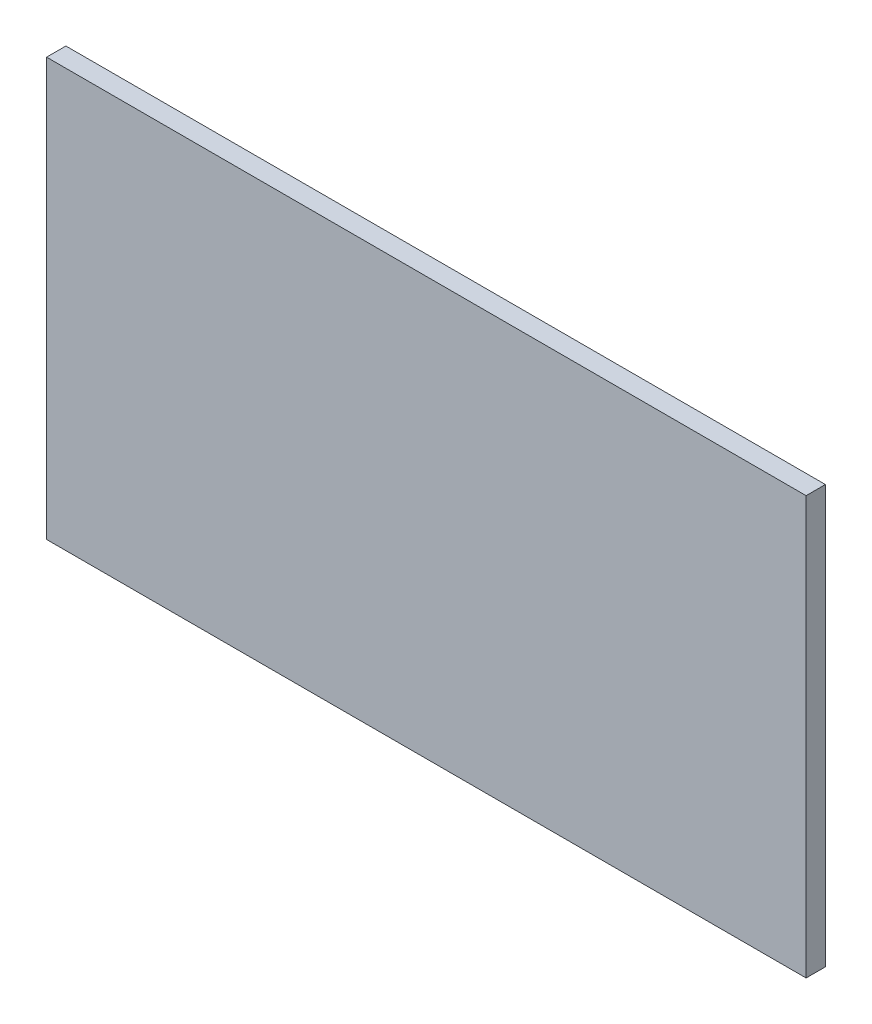
ISO-10303-21;
HEADER;
FILE_DESCRIPTION(('STEP AP214'),'2;1');
FILE_NAME('part.step','',(''),(''),'','','');
FILE_SCHEMA(('AUTOMOTIVE_DESIGN { 1 0 10303 214 1 1 1 1 }'));
ENDSEC;
DATA;
#1=APPLICATION_CONTEXT('core data for automotive mechanical design processes');
#2=APPLICATION_PROTOCOL_DEFINITION('international standard','automotive_design',2000,#1);
#3=PRODUCT_CONTEXT('',#1,'mechanical');
#4=PRODUCT('Part','Part','',(#3));
#5=PRODUCT_RELATED_PRODUCT_CATEGORY('part','',(#4));
#6=PRODUCT_DEFINITION_FORMATION('','',#4);
#7=PRODUCT_DEFINITION_CONTEXT('part definition',#1,'design');
#8=PRODUCT_DEFINITION('design','',#6,#7);
#9=PRODUCT_DEFINITION_SHAPE('','',#8);
#10=(LENGTH_UNIT() NAMED_UNIT(*) SI_UNIT(.MILLI.,.METRE.));
#11=(NAMED_UNIT(*) PLANE_ANGLE_UNIT() SI_UNIT($,.RADIAN.));
#12=(NAMED_UNIT(*) SI_UNIT($,.STERADIAN.) SOLID_ANGLE_UNIT());
#13=UNCERTAINTY_MEASURE_WITH_UNIT(LENGTH_MEASURE(1.E-05),#10,'distance_accuracy_value','');
#14=(GEOMETRIC_REPRESENTATION_CONTEXT(3) GLOBAL_UNCERTAINTY_ASSIGNED_CONTEXT((#13)) GLOBAL_UNIT_ASSIGNED_CONTEXT((#10,
#11,#12)) REPRESENTATION_CONTEXT('',''));
#15=CARTESIAN_POINT('',(0.,0.,0.));
#16=DIRECTION('',(0.,0.,1.));
#17=DIRECTION('',(1.,0.,0.));
#18=AXIS2_PLACEMENT_3D('',#15,#16,#17);
#19=CARTESIAN_POINT('',(50.,27.5,2.54));
#20=DIRECTION('',(-1.,0.,0.));
#21=DIRECTION('',(0.,-1.,0.));
#22=AXIS2_PLACEMENT_3D('',#19,#20,#21);
#23=PLANE('',#22);
#24=DIRECTION('',(0.,1.,0.));
#25=VECTOR('',#24,1.);
#26=CARTESIAN_POINT('',(50.,27.5,0.));
#27=LINE('',#26,#25);
#28=CARTESIAN_POINT('',(50.,-27.5,0.));
#29=VERTEX_POINT('',#28);
#30=CARTESIAN_POINT('',(50.,27.5,0.));
#31=VERTEX_POINT('',#30);
#32=EDGE_CURVE('E98',#29,#31,#27,.T.);
#33=ORIENTED_EDGE('',*,*,#32,.T.);
#34=DIRECTION('',(0.,0.,-1.));
#35=VECTOR('',#34,1.);
#36=CARTESIAN_POINT('',(50.,27.5,2.54));
#37=LINE('',#36,#35);
#38=CARTESIAN_POINT('',(50.,27.5,2.54));
#39=VERTEX_POINT('',#38);
#40=EDGE_CURVE('E11',#39,#31,#37,.T.);
#41=ORIENTED_EDGE('',*,*,#40,.F.);
#42=DIRECTION('',(0.,1.,0.));
#43=VECTOR('',#42,1.);
#44=CARTESIAN_POINT('',(50.,27.5,2.54));
#45=LINE('',#44,#43);
#46=CARTESIAN_POINT('',(50.,-27.5,2.54));
#47=VERTEX_POINT('',#46);
#48=EDGE_CURVE('E86',#47,#39,#45,.T.);
#49=ORIENTED_EDGE('',*,*,#48,.F.);
#50=DIRECTION('',(0.,0.,-1.));
#51=VECTOR('',#50,1.);
#52=CARTESIAN_POINT('',(50.,-27.5,2.54));
#53=LINE('',#52,#51);
#54=EDGE_CURVE('E94',#47,#29,#53,.T.);
#55=ORIENTED_EDGE('',*,*,#54,.T.);
#56=EDGE_LOOP('',(#33,#41,#49,#55));
#57=FACE_BOUND('',#56,.T.);
#58=ADVANCED_FACE('F35',(#57),#23,.F.);
#59=CARTESIAN_POINT('',(-50.,27.5,2.54));
#60=DIRECTION('',(0.,-1.,0.));
#61=DIRECTION('',(0.,0.,-1.));
#62=AXIS2_PLACEMENT_3D('',#59,#60,#61);
#63=PLANE('',#62);
#64=DIRECTION('',(-1.,0.,0.));
#65=VECTOR('',#64,1.);
#66=CARTESIAN_POINT('',(-50.,27.5,0.));
#67=LINE('',#66,#65);
#68=CARTESIAN_POINT('',(-50.,27.5,0.));
#69=VERTEX_POINT('',#68);
#70=EDGE_CURVE('E90',#31,#69,#67,.T.);
#71=ORIENTED_EDGE('',*,*,#70,.T.);
#72=DIRECTION('',(0.,0.,-1.));
#73=VECTOR('',#72,1.);
#74=CARTESIAN_POINT('',(-50.,27.5,2.54));
#75=LINE('',#74,#73);
#76=CARTESIAN_POINT('',(-50.,27.5,2.54));
#77=VERTEX_POINT('',#76);
#78=EDGE_CURVE('E43',#77,#69,#75,.T.);
#79=ORIENTED_EDGE('',*,*,#78,.F.);
#80=DIRECTION('',(-1.,0.,0.));
#81=VECTOR('',#80,1.);
#82=CARTESIAN_POINT('',(-50.,27.5,2.54));
#83=LINE('',#82,#81);
#84=EDGE_CURVE('E81',#39,#77,#83,.T.);
#85=ORIENTED_EDGE('',*,*,#84,.F.);
#86=ORIENTED_EDGE('',*,*,#40,.T.);
#87=EDGE_LOOP('',(#71,#79,#85,#86));
#88=FACE_BOUND('',#87,.T.);
#89=ADVANCED_FACE('F89',(#88),#63,.F.);
#90=CARTESIAN_POINT('',(-50.,27.5,2.54));
#91=DIRECTION('',(1.,0.,0.));
#92=DIRECTION('',(0.,1.,0.));
#93=AXIS2_PLACEMENT_3D('',#90,#91,#92);
#94=PLANE('',#93);
#95=DIRECTION('',(0.,-1.,0.));
#96=VECTOR('',#95,1.);
#97=CARTESIAN_POINT('',(-50.,27.5,0.));
#98=LINE('',#97,#96);
#99=CARTESIAN_POINT('',(-50.,-27.5,0.));
#100=VERTEX_POINT('',#99);
#101=EDGE_CURVE('E68',#69,#100,#98,.T.);
#102=ORIENTED_EDGE('',*,*,#101,.T.);
#103=DIRECTION('',(0.,0.,-1.));
#104=VECTOR('',#103,1.);
#105=CARTESIAN_POINT('',(-50.,-27.5,2.54));
#106=LINE('',#105,#104);
#107=CARTESIAN_POINT('',(-50.,-27.5,2.54));
#108=VERTEX_POINT('',#107);
#109=EDGE_CURVE('E91',#108,#100,#106,.T.);
#110=ORIENTED_EDGE('',*,*,#109,.F.);
#111=DIRECTION('',(0.,-1.,0.));
#112=VECTOR('',#111,1.);
#113=CARTESIAN_POINT('',(-50.,27.5,2.54));
#114=LINE('',#113,#112);
#115=EDGE_CURVE('E84',#77,#108,#114,.T.);
#116=ORIENTED_EDGE('',*,*,#115,.F.);
#117=ORIENTED_EDGE('',*,*,#78,.T.);
#118=EDGE_LOOP('',(#102,#110,#116,#117));
#119=FACE_BOUND('',#118,.T.);
#120=ADVANCED_FACE('F92',(#119),#94,.F.);
#121=CARTESIAN_POINT('',(-50.,-27.5,2.54));
#122=DIRECTION('',(0.,1.,0.));
#123=DIRECTION('',(0.,0.,1.));
#124=AXIS2_PLACEMENT_3D('',#121,#122,#123);
#125=PLANE('',#124);
#126=DIRECTION('',(1.,0.,0.));
#127=VECTOR('',#126,1.);
#128=CARTESIAN_POINT('',(-50.,-27.5,0.));
#129=LINE('',#128,#127);
#130=EDGE_CURVE('E74',#100,#29,#129,.T.);
#131=ORIENTED_EDGE('',*,*,#130,.T.);
#132=ORIENTED_EDGE('',*,*,#54,.F.);
#133=DIRECTION('',(1.,0.,0.));
#134=VECTOR('',#133,1.);
#135=CARTESIAN_POINT('',(-50.,-27.5,2.54));
#136=LINE('',#135,#134);
#137=EDGE_CURVE('E51',#108,#47,#136,.T.);
#138=ORIENTED_EDGE('',*,*,#137,.F.);
#139=ORIENTED_EDGE('',*,*,#109,.T.);
#140=EDGE_LOOP('',(#131,#132,#138,#139));
#141=FACE_BOUND('',#140,.T.);
#142=ADVANCED_FACE('F105',(#141),#125,.F.);
#143=CARTESIAN_POINT('',(0.,0.,2.54));
#144=DIRECTION('',(0.,0.,1.));
#145=DIRECTION('',(1.,0.,0.));
#146=AXIS2_PLACEMENT_3D('',#143,#144,#145);
#147=PLANE('',#146);
#148=ORIENTED_EDGE('',*,*,#48,.T.);
#149=ORIENTED_EDGE('',*,*,#84,.T.);
#150=ORIENTED_EDGE('',*,*,#115,.T.);
#151=ORIENTED_EDGE('',*,*,#137,.T.);
#152=EDGE_LOOP('',(#148,#149,#150,#151));
#153=FACE_BOUND('',#152,.T.);
#154=ADVANCED_FACE('F82',(#153),#147,.T.);
#155=CARTESIAN_POINT('',(0.,0.,0.));
#156=DIRECTION('',(0.,0.,1.));
#157=DIRECTION('',(1.,0.,0.));
#158=AXIS2_PLACEMENT_3D('',#155,#156,#157);
#159=PLANE('',#158);
#160=ORIENTED_EDGE('',*,*,#32,.F.);
#161=ORIENTED_EDGE('',*,*,#130,.F.);
#162=ORIENTED_EDGE('',*,*,#101,.F.);
#163=ORIENTED_EDGE('',*,*,#70,.F.);
#164=EDGE_LOOP('',(#160,#161,#162,#163));
#165=FACE_BOUND('',#164,.T.);
#166=ADVANCED_FACE('F108',(#165),#159,.F.);
#167=CLOSED_SHELL('',(#58,#89,#120,#142,#154,#166));
#168=MANIFOLD_SOLID_BREP('B2',#167);
#169=ADVANCED_BREP_SHAPE_REPRESENTATION('',(#18,#168),#14);
#170=SHAPE_DEFINITION_REPRESENTATION(#9,#169);
ENDSEC;
END-ISO-10303-21;
